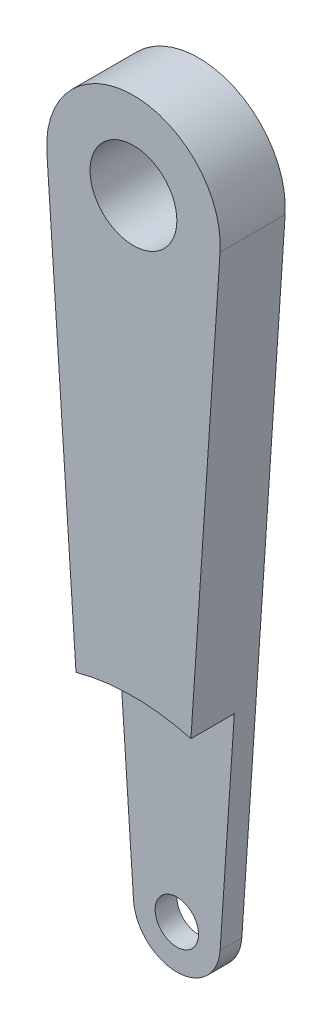
ISO-10303-21;
HEADER;
FILE_DESCRIPTION(('STEP AP214'),'2;1');
FILE_NAME('part.step','',(''),(''),'','','');
FILE_SCHEMA(('AUTOMOTIVE_DESIGN { 1 0 10303 214 1 1 1 1 }'));
ENDSEC;
DATA;
#1=APPLICATION_CONTEXT('core data for automotive mechanical design processes');
#2=APPLICATION_PROTOCOL_DEFINITION('international standard','automotive_design',2000,#1);
#3=PRODUCT_CONTEXT('',#1,'mechanical');
#4=PRODUCT('Part','Part','',(#3));
#5=PRODUCT_RELATED_PRODUCT_CATEGORY('part','',(#4));
#6=PRODUCT_DEFINITION_FORMATION('','',#4);
#7=PRODUCT_DEFINITION_CONTEXT('part definition',#1,'design');
#8=PRODUCT_DEFINITION('design','',#6,#7);
#9=PRODUCT_DEFINITION_SHAPE('','',#8);
#10=(LENGTH_UNIT() NAMED_UNIT(*) SI_UNIT(.MILLI.,.METRE.));
#11=(NAMED_UNIT(*) PLANE_ANGLE_UNIT() SI_UNIT($,.RADIAN.));
#12=(NAMED_UNIT(*) SI_UNIT($,.STERADIAN.) SOLID_ANGLE_UNIT());
#13=UNCERTAINTY_MEASURE_WITH_UNIT(LENGTH_MEASURE(1.E-05),#10,'distance_accuracy_value','');
#14=(GEOMETRIC_REPRESENTATION_CONTEXT(3) GLOBAL_UNCERTAINTY_ASSIGNED_CONTEXT((#13)) GLOBAL_UNIT_ASSIGNED_CONTEXT((#10,
#11,#12)) REPRESENTATION_CONTEXT('',''));
#15=CARTESIAN_POINT('',(0.,0.,0.));
#16=DIRECTION('',(0.,0.,1.));
#17=DIRECTION('',(1.,0.,0.));
#18=AXIS2_PLACEMENT_3D('',#15,#16,#17);
#19=CARTESIAN_POINT('',(0.,20.,3.));
#20=DIRECTION('',(0.,0.,-1.));
#21=DIRECTION('',(-1.,0.,0.));
#22=AXIS2_PLACEMENT_3D('',#19,#20,#21);
#23=CYLINDRICAL_SURFACE('',#22,2.);
#24=CARTESIAN_POINT('',(0.,20.,1.));
#25=DIRECTION('',(0.,0.,1.));
#26=DIRECTION('',(1.,0.,0.));
#27=AXIS2_PLACEMENT_3D('',#24,#25,#26);
#28=CIRCLE('',#27,2.);
#29=CARTESIAN_POINT('',(-1.99555060627944,19.8666666666667,1.));
#30=VERTEX_POINT('',#29);
#31=CARTESIAN_POINT('',(1.99555060627944,19.8666666666667,1.));
#32=VERTEX_POINT('',#31);
#33=EDGE_CURVE('E87',#30,#32,#28,.T.);
#34=ORIENTED_EDGE('',*,*,#33,.F.);
#35=DIRECTION('',(0.,0.,-1.));
#36=VECTOR('',#35,1.);
#37=CARTESIAN_POINT('',(-1.99555060627944,19.8666666666667,3.));
#38=LINE('',#37,#36);
#39=CARTESIAN_POINT('',(-1.99555060627944,19.8666666666667,0.));
#40=VERTEX_POINT('',#39);
#41=EDGE_CURVE('E80',#30,#40,#38,.T.);
#42=ORIENTED_EDGE('',*,*,#41,.T.);
#43=CARTESIAN_POINT('',(0.,20.,0.));
#44=DIRECTION('',(0.,0.,1.));
#45=DIRECTION('',(1.,0.,0.));
#46=AXIS2_PLACEMENT_3D('',#43,#44,#45);
#47=CIRCLE('',#46,2.);
#48=CARTESIAN_POINT('',(1.99555060627944,19.8666666666667,0.));
#49=VERTEX_POINT('',#48);
#50=EDGE_CURVE('E84',#40,#49,#47,.T.);
#51=ORIENTED_EDGE('',*,*,#50,.T.);
#52=DIRECTION('',(0.,0.,-1.));
#53=VECTOR('',#52,1.);
#54=CARTESIAN_POINT('',(1.99555060627944,19.8666666666667,3.));
#55=LINE('',#54,#53);
#56=EDGE_CURVE('E44',#32,#49,#55,.T.);
#57=ORIENTED_EDGE('',*,*,#56,.F.);
#58=EDGE_LOOP('',(#34,#42,#51,#57));
#59=FACE_BOUND('',#58,.T.);
#60=ADVANCED_FACE('F37',(#59),#23,.T.);
#61=CARTESIAN_POINT('',(0.,20.,3.));
#62=DIRECTION('',(0.,0.,-1.));
#63=DIRECTION('',(-1.,0.,0.));
#64=AXIS2_PLACEMENT_3D('',#61,#62,#63);
#65=CYLINDRICAL_SURFACE('',#64,1.);
#66=CARTESIAN_POINT('',(0.,20.,0.));
#67=DIRECTION('',(0.,0.,1.));
#68=DIRECTION('',(1.,0.,0.));
#69=AXIS2_PLACEMENT_3D('',#66,#67,#68);
#70=CIRCLE('',#69,1.);
#71=CARTESIAN_POINT('',(1.,20.,0.));
#72=VERTEX_POINT('',#71);
#73=EDGE_CURVE('E138',#72,#72,#70,.T.);
#74=ORIENTED_EDGE('',*,*,#73,.F.);
#75=EDGE_LOOP('',(#74));
#76=FACE_BOUND('',#75,.T.);
#77=CARTESIAN_POINT('',(0.,20.,1.));
#78=DIRECTION('',(0.,0.,1.));
#79=DIRECTION('',(1.,0.,0.));
#80=AXIS2_PLACEMENT_3D('',#77,#78,#79);
#81=CIRCLE('',#80,1.);
#82=CARTESIAN_POINT('',(1.,20.,1.));
#83=VERTEX_POINT('',#82);
#84=EDGE_CURVE('E121',#83,#83,#81,.T.);
#85=ORIENTED_EDGE('',*,*,#84,.T.);
#86=EDGE_LOOP('',(#85));
#87=FACE_BOUND('',#86,.T.);
#88=ADVANCED_FACE('F171',(#76,#87),#65,.F.);
#89=CARTESIAN_POINT('',(0.,20.,3.));
#90=DIRECTION('',(0.,0.,1.));
#91=DIRECTION('',(1.,0.,0.));
#92=AXIS2_PLACEMENT_3D('',#89,#90,#91);
#93=PLANE('',#92);
#94=CARTESIAN_POINT('',(0.,20.,3.));
#95=DIRECTION('',(0.,0.,1.));
#96=DIRECTION('',(1.,0.,0.));
#97=AXIS2_PLACEMENT_3D('',#94,#95,#96);
#98=CIRCLE('',#97,10.);
#99=CARTESIAN_POINT('',(2.64874787102162,29.6428281492391,3.));
#100=VERTEX_POINT('',#99);
#101=CARTESIAN_POINT('',(-2.64874787102162,29.6428281492391,3.));
#102=VERTEX_POINT('',#101);
#103=EDGE_CURVE('E127',#100,#102,#98,.T.);
#104=ORIENTED_EDGE('',*,*,#103,.F.);
#105=DIRECTION('',(0.0666666666666667,0.997775303139718,0.));
#106=VECTOR('',#105,1.);
#107=CARTESIAN_POINT('',(1.99555060627944,19.8666666666667,3.));
#108=LINE('',#107,#106);
#109=CARTESIAN_POINT('',(3.99110121255887,49.7333333333333,3.));
#110=VERTEX_POINT('',#109);
#111=EDGE_CURVE('E100',#100,#110,#108,.T.);
#112=ORIENTED_EDGE('',*,*,#111,.T.);
#113=CARTESIAN_POINT('',(0.,50.,3.));
#114=DIRECTION('',(0.,0.,1.));
#115=DIRECTION('',(1.,0.,0.));
#116=AXIS2_PLACEMENT_3D('',#113,#114,#115);
#117=CIRCLE('',#116,4.);
#118=CARTESIAN_POINT('',(-3.99110121255887,49.7333333333333,3.));
#119=VERTEX_POINT('',#118);
#120=EDGE_CURVE('E60',#110,#119,#117,.T.);
#121=ORIENTED_EDGE('',*,*,#120,.T.);
#122=DIRECTION('',(0.0666666666666667,-0.997775303139718,0.));
#123=VECTOR('',#122,1.);
#124=CARTESIAN_POINT('',(-1.99555060627944,19.8666666666667,3.));
#125=LINE('',#124,#123);
#126=EDGE_CURVE('E91',#119,#102,#125,.T.);
#127=ORIENTED_EDGE('',*,*,#126,.T.);
#128=EDGE_LOOP('',(#104,#112,#121,#127));
#129=FACE_BOUND('',#128,.T.);
#130=CARTESIAN_POINT('',(0.,50.,3.));
#131=DIRECTION('',(0.,0.,1.));
#132=DIRECTION('',(1.,0.,0.));
#133=AXIS2_PLACEMENT_3D('',#130,#131,#132);
#134=CIRCLE('',#133,2.);
#135=CARTESIAN_POINT('',(2.,50.,3.));
#136=VERTEX_POINT('',#135);
#137=EDGE_CURVE('E107',#136,#136,#134,.T.);
#138=ORIENTED_EDGE('',*,*,#137,.F.);
#139=EDGE_LOOP('',(#138));
#140=FACE_BOUND('',#139,.T.);
#141=ADVANCED_FACE('F145',(#129,#140),#93,.T.);
#142=CARTESIAN_POINT('',(0.,20.,0.));
#143=DIRECTION('',(0.,0.,1.));
#144=DIRECTION('',(1.,0.,0.));
#145=AXIS2_PLACEMENT_3D('',#142,#143,#144);
#146=PLANE('',#145);
#147=ORIENTED_EDGE('',*,*,#50,.F.);
#148=DIRECTION('',(0.0666666666666667,-0.997775303139718,0.));
#149=VECTOR('',#148,1.);
#150=CARTESIAN_POINT('',(-1.99555060627944,19.8666666666667,0.));
#151=LINE('',#150,#149);
#152=CARTESIAN_POINT('',(-3.99110121255887,49.7333333333333,0.));
#153=VERTEX_POINT('',#152);
#154=EDGE_CURVE('E95',#153,#40,#151,.T.);
#155=ORIENTED_EDGE('',*,*,#154,.F.);
#156=CARTESIAN_POINT('',(0.,50.,0.));
#157=DIRECTION('',(0.,0.,1.));
#158=DIRECTION('',(1.,0.,0.));
#159=AXIS2_PLACEMENT_3D('',#156,#157,#158);
#160=CIRCLE('',#159,4.);
#161=CARTESIAN_POINT('',(3.99110121255887,49.7333333333333,0.));
#162=VERTEX_POINT('',#161);
#163=EDGE_CURVE('E101',#162,#153,#160,.T.);
#164=ORIENTED_EDGE('',*,*,#163,.F.);
#165=DIRECTION('',(0.0666666666666667,0.997775303139718,0.));
#166=VECTOR('',#165,1.);
#167=CARTESIAN_POINT('',(1.99555060627944,19.8666666666667,0.));
#168=LINE('',#167,#166);
#169=EDGE_CURVE('E106',#49,#162,#168,.T.);
#170=ORIENTED_EDGE('',*,*,#169,.F.);
#171=EDGE_LOOP('',(#147,#155,#164,#170));
#172=FACE_BOUND('',#171,.T.);
#173=CARTESIAN_POINT('',(0.,50.,0.));
#174=DIRECTION('',(0.,0.,1.));
#175=DIRECTION('',(1.,0.,0.));
#176=AXIS2_PLACEMENT_3D('',#173,#174,#175);
#177=CIRCLE('',#176,2.);
#178=CARTESIAN_POINT('',(2.,50.,0.));
#179=VERTEX_POINT('',#178);
#180=EDGE_CURVE('E111',#179,#179,#177,.T.);
#181=ORIENTED_EDGE('',*,*,#180,.T.);
#182=EDGE_LOOP('',(#181));
#183=FACE_BOUND('',#182,.T.);
#184=ORIENTED_EDGE('',*,*,#73,.T.);
#185=EDGE_LOOP('',(#184));
#186=FACE_BOUND('',#185,.T.);
#187=ADVANCED_FACE('F104',(#172,#183,#186),#146,.F.);
#188=CARTESIAN_POINT('',(1.99555060627944,19.8666666666667,3.));
#189=DIRECTION('',(-0.997775303139718,0.0666666666666667,0.));
#190=DIRECTION('',(-0.0666666666666667,-0.997775303139718,0.));
#191=AXIS2_PLACEMENT_3D('',#188,#189,#190);
#192=PLANE('',#191);
#193=ORIENTED_EDGE('',*,*,#111,.F.);
#194=DIRECTION('',(0.,0.,1.));
#195=VECTOR('',#194,1.);
#196=CARTESIAN_POINT('',(2.64874787102162,29.6428281492391,1.));
#197=LINE('',#196,#195);
#198=CARTESIAN_POINT('',(2.64874787102162,29.6428281492391,1.));
#199=VERTEX_POINT('',#198);
#200=EDGE_CURVE('E135',#100,#199,#197,.F.);
#201=ORIENTED_EDGE('',*,*,#200,.T.);
#202=DIRECTION('',(0.0666666666666667,0.997775303139718,0.));
#203=VECTOR('',#202,1.);
#204=CARTESIAN_POINT('',(1.99555060627944,19.8666666666667,1.));
#205=LINE('',#204,#203);
#206=EDGE_CURVE('E133',#32,#199,#205,.T.);
#207=ORIENTED_EDGE('',*,*,#206,.F.);
#208=ORIENTED_EDGE('',*,*,#56,.T.);
#209=ORIENTED_EDGE('',*,*,#169,.T.);
#210=DIRECTION('',(0.,0.,-1.));
#211=VECTOR('',#210,1.);
#212=CARTESIAN_POINT('',(3.99110121255887,49.7333333333333,3.));
#213=LINE('',#212,#211);
#214=EDGE_CURVE('E118',#110,#162,#213,.T.);
#215=ORIENTED_EDGE('',*,*,#214,.F.);
#216=EDGE_LOOP('',(#193,#201,#207,#208,#209,#215));
#217=FACE_BOUND('',#216,.T.);
#218=ADVANCED_FACE('F157',(#217),#192,.F.);
#219=CARTESIAN_POINT('',(0.,50.,3.));
#220=DIRECTION('',(0.,0.,-1.));
#221=DIRECTION('',(-1.,0.,0.));
#222=AXIS2_PLACEMENT_3D('',#219,#220,#221);
#223=CYLINDRICAL_SURFACE('',#222,4.);
#224=ORIENTED_EDGE('',*,*,#163,.T.);
#225=DIRECTION('',(0.,0.,-1.));
#226=VECTOR('',#225,1.);
#227=CARTESIAN_POINT('',(-3.99110121255887,49.7333333333333,3.));
#228=LINE('',#227,#226);
#229=EDGE_CURVE('E90',#119,#153,#228,.T.);
#230=ORIENTED_EDGE('',*,*,#229,.F.);
#231=ORIENTED_EDGE('',*,*,#120,.F.);
#232=ORIENTED_EDGE('',*,*,#214,.T.);
#233=EDGE_LOOP('',(#224,#230,#231,#232));
#234=FACE_BOUND('',#233,.T.);
#235=ADVANCED_FACE('F190',(#234),#223,.T.);
#236=CARTESIAN_POINT('',(-1.99555060627944,19.8666666666667,3.));
#237=DIRECTION('',(0.997775303139718,0.0666666666666667,0.));
#238=DIRECTION('',(-0.0666666666666667,0.997775303139718,0.));
#239=AXIS2_PLACEMENT_3D('',#236,#237,#238);
#240=PLANE('',#239);
#241=DIRECTION('',(0.0666666666666667,-0.997775303139718,0.));
#242=VECTOR('',#241,1.);
#243=CARTESIAN_POINT('',(-1.99555060627944,19.8666666666667,1.));
#244=LINE('',#243,#242);
#245=CARTESIAN_POINT('',(-2.64874787102162,29.6428281492391,1.));
#246=VERTEX_POINT('',#245);
#247=EDGE_CURVE('E123',#246,#30,#244,.T.);
#248=ORIENTED_EDGE('',*,*,#247,.F.);
#249=DIRECTION('',(0.,0.,1.));
#250=VECTOR('',#249,1.);
#251=CARTESIAN_POINT('',(-2.64874787102162,29.6428281492391,1.));
#252=LINE('',#251,#250);
#253=EDGE_CURVE('E11',#246,#102,#252,.T.);
#254=ORIENTED_EDGE('',*,*,#253,.T.);
#255=ORIENTED_EDGE('',*,*,#126,.F.);
#256=ORIENTED_EDGE('',*,*,#229,.T.);
#257=ORIENTED_EDGE('',*,*,#154,.T.);
#258=ORIENTED_EDGE('',*,*,#41,.F.);
#259=EDGE_LOOP('',(#248,#254,#255,#256,#257,#258));
#260=FACE_BOUND('',#259,.T.);
#261=ADVANCED_FACE('F96',(#260),#240,.F.);
#262=CARTESIAN_POINT('',(0.,50.,3.));
#263=DIRECTION('',(0.,0.,-1.));
#264=DIRECTION('',(-1.,0.,0.));
#265=AXIS2_PLACEMENT_3D('',#262,#263,#264);
#266=CYLINDRICAL_SURFACE('',#265,2.);
#267=ORIENTED_EDGE('',*,*,#137,.T.);
#268=EDGE_LOOP('',(#267));
#269=FACE_BOUND('',#268,.T.);
#270=ORIENTED_EDGE('',*,*,#180,.F.);
#271=EDGE_LOOP('',(#270));
#272=FACE_BOUND('',#271,.T.);
#273=ADVANCED_FACE('F168',(#269,#272),#266,.F.);
#274=CARTESIAN_POINT('',(0.,20.,1.));
#275=DIRECTION('',(0.,0.,1.));
#276=DIRECTION('',(1.,0.,0.));
#277=AXIS2_PLACEMENT_3D('',#274,#275,#276);
#278=CYLINDRICAL_SURFACE('',#277,10.);
#279=ORIENTED_EDGE('',*,*,#103,.T.);
#280=ORIENTED_EDGE('',*,*,#253,.F.);
#281=CARTESIAN_POINT('',(0.,20.,1.));
#282=DIRECTION('',(0.,0.,1.));
#283=DIRECTION('',(1.,0.,0.));
#284=AXIS2_PLACEMENT_3D('',#281,#282,#283);
#285=CIRCLE('',#284,10.);
#286=EDGE_CURVE('E51',#199,#246,#285,.T.);
#287=ORIENTED_EDGE('',*,*,#286,.F.);
#288=ORIENTED_EDGE('',*,*,#200,.F.);
#289=EDGE_LOOP('',(#279,#280,#287,#288));
#290=FACE_BOUND('',#289,.T.);
#291=ADVANCED_FACE('F152',(#290),#278,.F.);
#292=CARTESIAN_POINT('',(0.,20.,1.));
#293=DIRECTION('',(0.,0.,1.));
#294=DIRECTION('',(1.,0.,0.));
#295=AXIS2_PLACEMENT_3D('',#292,#293,#294);
#296=PLANE('',#295);
#297=ORIENTED_EDGE('',*,*,#84,.F.);
#298=EDGE_LOOP('',(#297));
#299=FACE_BOUND('',#298,.T.);
#300=ORIENTED_EDGE('',*,*,#206,.T.);
#301=ORIENTED_EDGE('',*,*,#286,.T.);
#302=ORIENTED_EDGE('',*,*,#247,.T.);
#303=ORIENTED_EDGE('',*,*,#33,.T.);
#304=EDGE_LOOP('',(#300,#301,#302,#303));
#305=FACE_BOUND('',#304,.T.);
#306=ADVANCED_FACE('F161',(#299,#305),#296,.T.);
#307=CLOSED_SHELL('',(#60,#88,#141,#187,#218,#235,#261,#273,#291,#306));
#308=MANIFOLD_SOLID_BREP('B2',#307);
#309=ADVANCED_BREP_SHAPE_REPRESENTATION('',(#18,#308),#14);
#310=SHAPE_DEFINITION_REPRESENTATION(#9,#309);
ENDSEC;
END-ISO-10303-21;
